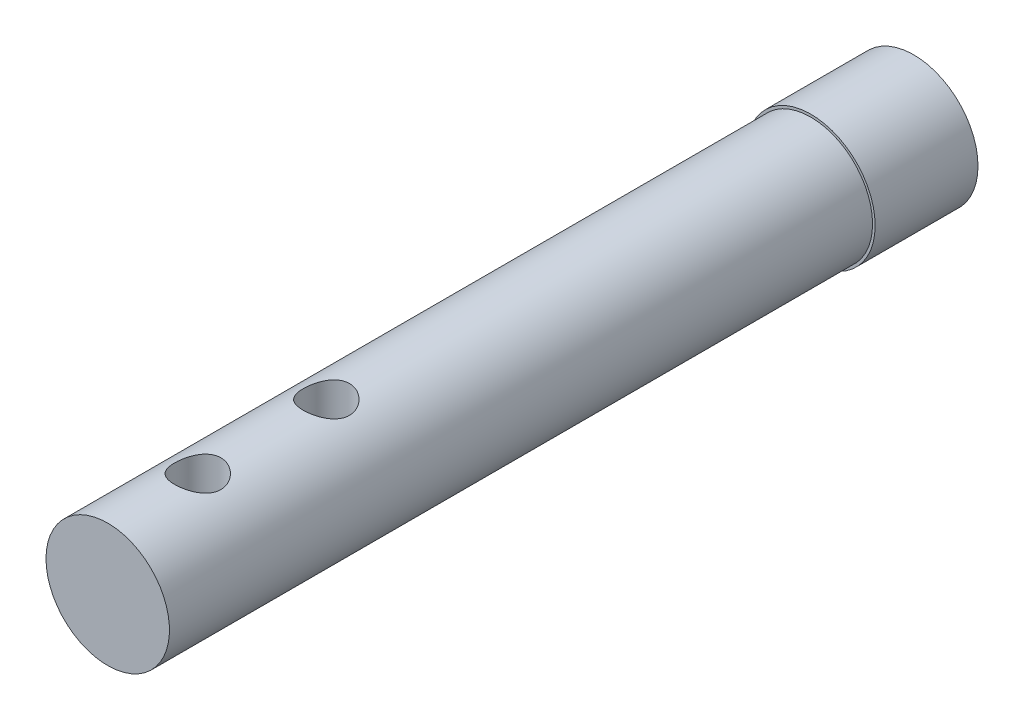
ISO-10303-21;
HEADER;
FILE_DESCRIPTION(('STEP AP214'),'2;1');
FILE_NAME('part.step','',(''),(''),'','','');
FILE_SCHEMA(('AUTOMOTIVE_DESIGN { 1 0 10303 214 1 1 1 1 }'));
ENDSEC;
DATA;
#1=APPLICATION_CONTEXT('core data for automotive mechanical design processes');
#2=APPLICATION_PROTOCOL_DEFINITION('international standard','automotive_design',2000,#1);
#3=PRODUCT_CONTEXT('',#1,'mechanical');
#4=PRODUCT('Part','Part','',(#3));
#5=PRODUCT_RELATED_PRODUCT_CATEGORY('part','',(#4));
#6=PRODUCT_DEFINITION_FORMATION('','',#4);
#7=PRODUCT_DEFINITION_CONTEXT('part definition',#1,'design');
#8=PRODUCT_DEFINITION('design','',#6,#7);
#9=PRODUCT_DEFINITION_SHAPE('','',#8);
#10=(LENGTH_UNIT() NAMED_UNIT(*) SI_UNIT(.MILLI.,.METRE.));
#11=(NAMED_UNIT(*) PLANE_ANGLE_UNIT() SI_UNIT($,.RADIAN.));
#12=(NAMED_UNIT(*) SI_UNIT($,.STERADIAN.) SOLID_ANGLE_UNIT());
#13=UNCERTAINTY_MEASURE_WITH_UNIT(LENGTH_MEASURE(1.E-05),#10,'distance_accuracy_value','');
#14=(GEOMETRIC_REPRESENTATION_CONTEXT(3) GLOBAL_UNCERTAINTY_ASSIGNED_CONTEXT((#13)) GLOBAL_UNIT_ASSIGNED_CONTEXT((#10,
#11,#12)) REPRESENTATION_CONTEXT('',''));
#15=CARTESIAN_POINT('',(0.,0.,0.));
#16=DIRECTION('',(0.,0.,1.));
#17=DIRECTION('',(1.,0.,0.));
#18=AXIS2_PLACEMENT_3D('',#15,#16,#17);
#19=CARTESIAN_POINT('',(0.,0.,35.));
#20=DIRECTION('',(0.,0.,-1.));
#21=DIRECTION('',(-1.,0.,0.));
#22=AXIS2_PLACEMENT_3D('',#19,#20,#21);
#23=CYLINDRICAL_SURFACE('',#22,12.5);
#24=CARTESIAN_POINT('',(0.,0.,35.));
#25=DIRECTION('',(0.,0.,1.));
#26=DIRECTION('',(1.,0.,0.));
#27=AXIS2_PLACEMENT_3D('',#24,#25,#26);
#28=CIRCLE('',#27,12.5);
#29=CARTESIAN_POINT('',(12.5,0.,35.));
#30=VERTEX_POINT('',#29);
#31=EDGE_CURVE('E37',#30,#30,#28,.T.);
#32=ORIENTED_EDGE('',*,*,#31,.F.);
#33=EDGE_LOOP('',(#32));
#34=FACE_BOUND('',#33,.T.);
#35=CARTESIAN_POINT('',(0.,0.,15.));
#36=DIRECTION('',(0.,0.,1.));
#37=DIRECTION('',(1.,0.,0.));
#38=AXIS2_PLACEMENT_3D('',#35,#36,#37);
#39=CIRCLE('',#38,12.5);
#40=CARTESIAN_POINT('',(12.5,0.,15.));
#41=VERTEX_POINT('',#40);
#42=EDGE_CURVE('E42',#41,#41,#39,.T.);
#43=ORIENTED_EDGE('',*,*,#42,.T.);
#44=EDGE_LOOP('',(#43));
#45=FACE_BOUND('',#44,.T.);
#46=ADVANCED_FACE('F30',(#34,#45),#23,.T.);
#47=CARTESIAN_POINT('',(0.,0.,35.));
#48=DIRECTION('',(0.,0.,1.));
#49=DIRECTION('',(1.,0.,0.));
#50=AXIS2_PLACEMENT_3D('',#47,#48,#49);
#51=PLANE('',#50);
#52=CARTESIAN_POINT('',(0.,0.,35.));
#53=DIRECTION('',(0.,0.,1.));
#54=DIRECTION('',(1.,0.,0.));
#55=AXIS2_PLACEMENT_3D('',#52,#53,#54);
#56=CIRCLE('',#55,12.);
#57=CARTESIAN_POINT('',(12.,0.,35.));
#58=VERTEX_POINT('',#57);
#59=EDGE_CURVE('E10',#58,#58,#56,.T.);
#60=ORIENTED_EDGE('',*,*,#59,.F.);
#61=EDGE_LOOP('',(#60));
#62=FACE_BOUND('',#61,.T.);
#63=ORIENTED_EDGE('',*,*,#31,.T.);
#64=EDGE_LOOP('',(#63));
#65=FACE_BOUND('',#64,.T.);
#66=ADVANCED_FACE('F98',(#62,#65),#51,.T.);
#67=CARTESIAN_POINT('',(0.,0.,15.));
#68=DIRECTION('',(0.,0.,1.));
#69=DIRECTION('',(1.,0.,0.));
#70=AXIS2_PLACEMENT_3D('',#67,#68,#69);
#71=PLANE('',#70);
#72=ORIENTED_EDGE('',*,*,#42,.F.);
#73=EDGE_LOOP('',(#72));
#74=FACE_BOUND('',#73,.T.);
#75=ADVANCED_FACE('F103',(#74),#71,.F.);
#76=CARTESIAN_POINT('',(0.,0.,174.2));
#77=DIRECTION('',(0.,0.,-1.));
#78=DIRECTION('',(-1.,0.,0.));
#79=AXIS2_PLACEMENT_3D('',#76,#77,#78);
#80=CYLINDRICAL_SURFACE('',#79,12.);
#81=CARTESIAN_POINT('',(0.,0.,171.7));
#82=DIRECTION('',(0.,0.,-1.));
#83=DIRECTION('',(-1.,0.,0.));
#84=AXIS2_PLACEMENT_3D('',#81,#82,#83);
#85=CIRCLE('',#84,12.);
#86=CARTESIAN_POINT('',(-12.,0.,171.7));
#87=VERTEX_POINT('',#86);
#88=EDGE_CURVE('E33',#87,#87,#85,.T.);
#89=ORIENTED_EDGE('',*,*,#88,.T.);
#90=EDGE_LOOP('',(#89));
#91=FACE_BOUND('',#90,.T.);
#92=CARTESIAN_POINT('',(0.,-12.,133.7));
#93=CARTESIAN_POINT('',(0.121821920216141,-12.0000004149463,133.700000562589));
#94=CARTESIAN_POINT('',(0.243636002691335,-11.9981409348073,133.695049364538));
#95=CARTESIAN_POINT('',(0.486392423781216,-11.9907535477711,133.675293911887));
#96=CARTESIAN_POINT('',(0.607334471202253,-11.9852244680872,133.660486507286));
#97=CARTESIAN_POINT('',(0.847347381687188,-11.970649565472,133.621174413436));
#98=CARTESIAN_POINT('',(0.966419205128135,-11.9616056132673,133.596674882519));
#99=CARTESIAN_POINT('',(1.2019581040135,-11.9402382455256,133.53820576059));
#100=CARTESIAN_POINT('',(1.31842414848255,-11.9279135559973,133.504232490447));
#101=CARTESIAN_POINT('',(1.54765442429004,-11.9003384511568,133.427214849951));
#102=CARTESIAN_POINT('',(1.66042673449101,-11.8850950009216,133.384192050998));
#103=CARTESIAN_POINT('',(1.88185705605879,-11.8520536393113,133.289393964956));
#104=CARTESIAN_POINT('',(1.99051352350809,-11.8342547811235,133.237615432482));
#105=CARTESIAN_POINT('',(2.30927279411985,-11.7776768093622,133.069731594457));
#106=CARTESIAN_POINT('',(2.51234231941558,-11.7356939966761,132.941018203868));
#107=CARTESIAN_POINT('',(2.90206977477989,-11.6455850212357,132.648156633399));
#108=CARTESIAN_POINT('',(3.08780172063125,-11.5972851945296,132.482840477992));
#109=CARTESIAN_POINT('',(3.42974311725175,-11.500801507554,132.123737421702));
#110=CARTESIAN_POINT('',(3.58594353155377,-11.4526176872201,131.929941838426));
#111=CARTESIAN_POINT('',(3.79764477617944,-11.3834841407686,131.617559070828));
#112=CARTESIAN_POINT('',(3.86547493196535,-11.3605705131175,131.507562616254));
#113=CARTESIAN_POINT('',(3.99157408188856,-11.3168804194774,131.281831512047));
#114=CARTESIAN_POINT('',(4.04984690983616,-11.2961030977882,131.166099187672));
#115=CARTESIAN_POINT('',(4.15634309619244,-11.257354412399,130.929634242611));
#116=CARTESIAN_POINT('',(4.20456527896397,-11.2393833770156,130.808901038945));
#117=CARTESIAN_POINT('',(4.29047551547084,-11.2068698048304,130.563350953977));
#118=CARTESIAN_POINT('',(4.32816865016454,-11.1923256148824,130.438536074949));
#119=CARTESIAN_POINT('',(4.3913383306389,-11.167687799886,130.190864282486));
#120=CARTESIAN_POINT('',(4.41724869222401,-11.1574374723367,130.068133574559));
#121=CARTESIAN_POINT('',(4.45874705417236,-11.1409189584307,129.820724885637));
#122=CARTESIAN_POINT('',(4.47433956871922,-11.1346490306496,129.696047780687));
#123=CARTESIAN_POINT('',(4.49504192825722,-11.1263077224061,129.445703904304));
#124=CARTESIAN_POINT('',(4.50015334189904,-11.124235713664,129.320037283793));
#125=CARTESIAN_POINT('',(4.4998396408155,-11.124362586323,129.068723898627));
#126=CARTESIAN_POINT('',(4.49441493477359,-11.1265613020677,128.94307713339));
#127=CARTESIAN_POINT('',(4.47373138181252,-11.1348931002806,128.700345583509));
#128=CARTESIAN_POINT('',(4.45908334347361,-11.1407817124043,128.583200175152));
#129=CARTESIAN_POINT('',(4.42068867776497,-11.1560711786316,128.350631735769));
#130=CARTESIAN_POINT('',(4.39693902815624,-11.1654731993557,128.235209290103));
#131=CARTESIAN_POINT('',(4.31234407385654,-11.1985472030748,127.892770983112));
#132=CARTESIAN_POINT('',(4.23813423625877,-11.2270952052095,127.669371280221));
#133=CARTESIAN_POINT('',(4.05490721343478,-11.294571324263,127.234132319446));
#134=CARTESIAN_POINT('',(3.94525805379047,-11.3336856090865,127.02259174478));
#135=CARTESIAN_POINT('',(3.69468362169031,-11.417826234714,126.620172587469));
#136=CARTESIAN_POINT('',(3.55374755073013,-11.4628546145386,126.429301172593));
#137=CARTESIAN_POINT('',(3.23345300799872,-11.5574411862383,126.060186122089));
#138=CARTESIAN_POINT('',(3.05214885027355,-11.607100429164,125.88365330368));
#139=CARTESIAN_POINT('',(2.66193788370924,-11.7027518394278,125.562986875577));
#140=CARTESIAN_POINT('',(2.45302684040981,-11.7487434424691,125.418858245353));
#141=CARTESIAN_POINT('',(2.00917028059687,-11.8327918458053,125.165208596408));
#142=CARTESIAN_POINT('',(1.77387213379261,-11.8707149483013,125.056257198474));
#143=CARTESIAN_POINT('',(1.28651055931184,-11.9333615492963,124.880052245027));
#144=CARTESIAN_POINT('',(1.03445463312944,-11.9580909097264,124.8127801694));
#145=CARTESIAN_POINT('',(0.535125728885334,-11.9905332973328,124.725131619306));
#146=CARTESIAN_POINT('',(0.288310863440804,-11.9990810722223,124.702452162351));
#147=CARTESIAN_POINT('',(-0.205717430518202,-12.0007768095524,124.697926826798));
#148=CARTESIAN_POINT('',(-0.452930758520925,-11.9939281862917,124.716071894972));
#149=CARTESIAN_POINT('',(-0.930786126866781,-11.9661512982893,124.790930073153));
#150=CARTESIAN_POINT('',(-1.16169991458787,-11.9457741475744,124.846134437354));
#151=CARTESIAN_POINT('',(-1.61082533431484,-11.8935442940439,124.991558411525));
#152=CARTESIAN_POINT('',(-1.82903531000968,-11.8616900987367,125.081782575637));
#153=CARTESIAN_POINT('',(-2.25374302875422,-11.7884888040033,125.297558494317));
#154=CARTESIAN_POINT('',(-2.45970824228689,-11.7468902777666,125.424070377444));
#155=CARTESIAN_POINT('',(-2.8481791439392,-11.6587998753534,125.70775712078));
#156=CARTESIAN_POINT('',(-3.03067612982123,-11.6123061955645,125.864943301224));
#157=CARTESIAN_POINT('',(-3.37808840855275,-11.516200958323,126.216201253386));
#158=CARTESIAN_POINT('',(-3.54136933947529,-11.4665650100461,126.411883953797));
#159=CARTESIAN_POINT('',(-3.8331467865608,-11.372360357102,126.828996752467));
#160=CARTESIAN_POINT('',(-3.96164017919756,-11.3277921076647,127.050429160208));
#161=CARTESIAN_POINT('',(-4.12541953452076,-11.2687303690453,127.397922796397));
#162=CARTESIAN_POINT('',(-4.17527938653559,-11.2503030894951,127.516647329586));
#163=CARTESIAN_POINT('',(-4.26475585416723,-11.2166905930926,127.758323845116));
#164=CARTESIAN_POINT('',(-4.30437682733462,-11.2015039975232,127.881274003754));
#165=CARTESIAN_POINT('',(-4.37296242168506,-11.1749073223601,128.130466472104));
#166=CARTESIAN_POINT('',(-4.40193024471254,-11.163496108165,128.256707780413));
#167=CARTESIAN_POINT('',(-4.44890662829911,-11.1448585297206,128.51151813959));
#168=CARTESIAN_POINT('',(-4.46691595320739,-11.1376318736025,128.640087027466));
#169=CARTESIAN_POINT('',(-4.4909611175474,-11.1279568107625,128.890138338187));
#170=CARTESIAN_POINT('',(-4.4976937576826,-11.1252304971503,129.011543515748));
#171=CARTESIAN_POINT('',(-4.50131029580419,-11.1237678185175,129.254568299403));
#172=CARTESIAN_POINT('',(-4.49819087218451,-11.1250327991546,129.376187963996));
#173=CARTESIAN_POINT('',(-4.48213280066959,-11.131512007523,129.618611778483));
#174=CARTESIAN_POINT('',(-4.46919877710471,-11.1367243753675,129.739416285416));
#175=CARTESIAN_POINT('',(-4.4336489114592,-11.150924738849,129.979410101132));
#176=CARTESIAN_POINT('',(-4.41102942370239,-11.1599141561698,130.098598784262));
#177=CARTESIAN_POINT('',(-4.35718066722756,-11.1810458214159,130.330811506595));
#178=CARTESIAN_POINT('',(-4.32623979458421,-11.1930817833517,130.443912139277));
#179=CARTESIAN_POINT('',(-4.25575591081443,-11.220069483486,130.667056271898));
#180=CARTESIAN_POINT('',(-4.216209885475,-11.23502224319,130.777098685333));
#181=CARTESIAN_POINT('',(-4.08512625929659,-11.2836374066331,131.101595505612));
#182=CARTESIAN_POINT('',(-3.98110253179988,-11.3210734609741,131.310592817196));
#183=CARTESIAN_POINT('',(-3.73655960136618,-11.4041928736043,131.719509886323));
#184=CARTESIAN_POINT('',(-3.59441315608531,-11.4502056852775,131.918379513829));
#185=CARTESIAN_POINT('',(-3.28000639093494,-11.5441926723435,132.290437563583));
#186=CARTESIAN_POINT('',(-3.10773650011229,-11.5921674673836,132.463617791262));
#187=CARTESIAN_POINT('',(-2.82485495768736,-11.6632064644304,132.705245875948));
#188=CARTESIAN_POINT('',(-2.72355677041139,-11.6873329442322,132.784523984934));
#189=CARTESIAN_POINT('',(-2.5143325103599,-11.7341212355869,132.934254321495));
#190=CARTESIAN_POINT('',(-2.40640888366377,-11.7567835814237,133.004709777492));
#191=CARTESIAN_POINT('',(-2.18454509687348,-11.8000231112314,133.136294134108));
#192=CARTESIAN_POINT('',(-2.07060177268691,-11.8205991816831,133.197418062869));
#193=CARTESIAN_POINT('',(-1.83755175113718,-11.8590616275344,133.309759993606));
#194=CARTESIAN_POINT('',(-1.71844727331547,-11.8769491446375,133.36098220304));
#195=CARTESIAN_POINT('',(-1.47053797162902,-11.9102407175975,133.455097964792));
#196=CARTESIAN_POINT('',(-1.34153686175291,-11.9255011706843,133.497526838323));
#197=CARTESIAN_POINT('',(-1.07989915577463,-11.9520331999052,133.570612963128));
#198=CARTESIAN_POINT('',(-0.947264179674953,-11.9633065233273,133.601275371348));
#199=CARTESIAN_POINT('',(-0.679492491904581,-11.9814979813589,133.650485060083));
#200=CARTESIAN_POINT('',(-0.544356226207072,-11.9884168847946,133.669034479318));
#201=CARTESIAN_POINT('',(-0.272809934790551,-11.9976674031164,133.693790938277));
#202=CARTESIAN_POINT('',(-0.136400054481801,-11.9999995353981,133.699999370088));
#203=CARTESIAN_POINT('',(0.,-12.,133.7));
#204=B_SPLINE_CURVE_WITH_KNOTS('',3,(#92,#93,#94,#95,#96,#97,#98,#99,#100,#101,#102,#103,#104,
#105,#106,#107,#108,#109,#110,#111,#112,#113,#114,#115,#116,#117,#118,#119,#120,#121,#122,#123,
#124,#125,#126,#127,#128,#129,#130,#131,#132,#133,#134,#135,#136,#137,#138,#139,#140,#141,#142,
#143,#144,#145,#146,#147,#148,#149,#150,#151,#152,#153,#154,#155,#156,#157,#158,#159,#160,#161,
#162,#163,#164,#165,#166,#167,#168,#169,#170,#171,#172,#173,#174,#175,#176,#177,#178,#179,#180,
#181,#182,#183,#184,#185,#186,#187,#188,#189,#190,#191,#192,#193,#194,#195,#196,#197,#198,#199,
#200,#201,#202,#203),.UNSPECIFIED.,.T.,.F.,(4,2,2,2,2,2,2,2,2,2,2,2,2,2,2,2,2,2,2,2,2,2,2,2,2,2,
2,2,2,2,2,2,2,2,2,2,2,2,2,2,2,2,2,2,2,2,2,2,2,2,2,2,2,2,2,4),(0.,0.365338024506953,
0.730792865566528,1.09605346575198,1.46145611308566,1.82599742407275,2.19067415273864,
2.91947018392637,3.67616860257937,4.43309819286657,4.82642681378567,5.21959726757261,
5.6128136852447,6.00584002102328,6.38291145568139,6.75981780772976,7.13666774608809,
7.5135030671805,7.86768402280124,8.22198268815958,8.92994647641832,9.65130458621122,
10.3729120569284,11.143016934675,11.9132400717527,12.6953735931829,13.477159325566,
14.2173829236784,14.9574423863163,15.6690654723159,16.3807811322343,17.1134089903886,
17.8463077351967,18.6217279182704,19.3972177022049,19.7870381951626,20.1766925107005,
20.5662296182681,20.9557395527225,21.3201489316714,21.6846811837187,22.0490417862153,
22.4135396573091,22.7667469946614,23.1200782532196,23.8262105801188,24.5693581369517,
25.3127422403355,25.7049754844993,26.0970647789657,26.4893622558027,26.8814926686161,
27.2908478409866,27.7000233978563,28.1091266894863,28.5181838309154),.UNSPECIFIED.);
#205=CARTESIAN_POINT('',(0.,-12.,133.7));
#206=VERTEX_POINT('',#205);
#207=EDGE_CURVE('E56',#206,#206,#204,.T.);
#208=ORIENTED_EDGE('',*,*,#207,.T.);
#209=EDGE_LOOP('',(#208));
#210=FACE_BOUND('',#209,.T.);
#211=CARTESIAN_POINT('',(0.,12.,133.7));
#212=CARTESIAN_POINT('',(-0.121821920216148,12.0000004149463,133.700000562589));
#213=CARTESIAN_POINT('',(-0.243636002691342,11.9981409348073,133.695049364538));
#214=CARTESIAN_POINT('',(-0.486392423781223,11.9907535477711,133.675293911887));
#215=CARTESIAN_POINT('',(-0.60733447120226,11.9852244680872,133.660486507286));
#216=CARTESIAN_POINT('',(-0.847347381687196,11.970649565472,133.621174413436));
#217=CARTESIAN_POINT('',(-0.966419205128143,11.9616056132673,133.596674882519));
#218=CARTESIAN_POINT('',(-1.20195810401351,11.9402382455256,133.53820576059));
#219=CARTESIAN_POINT('',(-1.31842414848256,11.9279135559973,133.504232490447));
#220=CARTESIAN_POINT('',(-1.54765442429005,11.9003384511568,133.427214849951));
#221=CARTESIAN_POINT('',(-1.66042673449102,11.8850950009216,133.384192050998));
#222=CARTESIAN_POINT('',(-1.88185705605881,11.8520536393113,133.289393964956));
#223=CARTESIAN_POINT('',(-1.9905135235081,11.8342547811235,133.237615432482));
#224=CARTESIAN_POINT('',(-2.30927279411986,11.7776768093622,133.069731594457));
#225=CARTESIAN_POINT('',(-2.51234231941559,11.7356939966761,132.941018203868));
#226=CARTESIAN_POINT('',(-2.9020697747799,11.6455850212357,132.648156633399));
#227=CARTESIAN_POINT('',(-3.08780172063126,11.5972851945296,132.482840477992));
#228=CARTESIAN_POINT('',(-3.42974311725176,11.500801507554,132.123737421702));
#229=CARTESIAN_POINT('',(-3.58594353155377,11.4526176872201,131.929941838426));
#230=CARTESIAN_POINT('',(-3.79764477617945,11.3834841407686,131.617559070828));
#231=CARTESIAN_POINT('',(-3.86547493196536,11.3605705131175,131.507562616254));
#232=CARTESIAN_POINT('',(-3.99157408188856,11.3168804194774,131.281831512047));
#233=CARTESIAN_POINT('',(-4.04984690983617,11.2961030977882,131.166099187672));
#234=CARTESIAN_POINT('',(-4.15634309619245,11.257354412399,130.929634242611));
#235=CARTESIAN_POINT('',(-4.20456527896398,11.2393833770156,130.808901038945));
#236=CARTESIAN_POINT('',(-4.29047551547085,11.2068698048304,130.563350953977));
#237=CARTESIAN_POINT('',(-4.32816865016455,11.1923256148824,130.438536074949));
#238=CARTESIAN_POINT('',(-4.3913383306389,11.167687799886,130.190864282486));
#239=CARTESIAN_POINT('',(-4.41724869222402,11.1574374723367,130.068133574559));
#240=CARTESIAN_POINT('',(-4.45874705417237,11.1409189584307,129.820724885637));
#241=CARTESIAN_POINT('',(-4.47433956871923,11.1346490306496,129.696047780687));
#242=CARTESIAN_POINT('',(-4.49504192825722,11.1263077224061,129.445703904304));
#243=CARTESIAN_POINT('',(-4.50015334189905,11.124235713664,129.320037283793));
#244=CARTESIAN_POINT('',(-4.49983964081551,11.124362586323,129.068723898627));
#245=CARTESIAN_POINT('',(-4.4944149347736,11.1265613020677,128.94307713339));
#246=CARTESIAN_POINT('',(-4.47373138181252,11.1348931002806,128.700345583509));
#247=CARTESIAN_POINT('',(-4.45908334347362,11.1407817124043,128.583200175152));
#248=CARTESIAN_POINT('',(-4.42068867776498,11.1560711786316,128.350631735769));
#249=CARTESIAN_POINT('',(-4.39693902815624,11.1654731993557,128.235209290103));
#250=CARTESIAN_POINT('',(-4.31234407385655,11.1985472030748,127.892770983112));
#251=CARTESIAN_POINT('',(-4.23813423625877,11.2270952052095,127.669371280221));
#252=CARTESIAN_POINT('',(-4.05490721343479,11.294571324263,127.234132319446));
#253=CARTESIAN_POINT('',(-3.94525805379048,11.3336856090865,127.02259174478));
#254=CARTESIAN_POINT('',(-3.69468362169032,11.417826234714,126.620172587469));
#255=CARTESIAN_POINT('',(-3.55374755073014,11.4628546145386,126.429301172593));
#256=CARTESIAN_POINT('',(-3.23345300799872,11.5574411862383,126.060186122089));
#257=CARTESIAN_POINT('',(-3.05214885027355,11.607100429164,125.88365330368));
#258=CARTESIAN_POINT('',(-2.66193788370925,11.7027518394278,125.562986875577));
#259=CARTESIAN_POINT('',(-2.45302684040981,11.7487434424691,125.418858245353));
#260=CARTESIAN_POINT('',(-2.00917028059688,11.8327918458053,125.165208596408));
#261=CARTESIAN_POINT('',(-1.77387213379261,11.8707149483013,125.056257198474));
#262=CARTESIAN_POINT('',(-1.28651055931184,11.9333615492963,124.880052245027));
#263=CARTESIAN_POINT('',(-1.03445463312944,11.9580909097264,124.8127801694));
#264=CARTESIAN_POINT('',(-0.535125728885343,11.9905332973328,124.725131619306));
#265=CARTESIAN_POINT('',(-0.288310863440812,11.9990810722223,124.702452162351));
#266=CARTESIAN_POINT('',(0.205717430518194,12.0007768095524,124.697926826798));
#267=CARTESIAN_POINT('',(0.452930758520917,11.9939281862917,124.716071894972));
#268=CARTESIAN_POINT('',(0.930786126866772,11.9661512982893,124.790930073153));
#269=CARTESIAN_POINT('',(1.16169991458786,11.9457741475744,124.846134437354));
#270=CARTESIAN_POINT('',(1.61082533431484,11.8935442940439,124.991558411525));
#271=CARTESIAN_POINT('',(1.82903531000967,11.8616900987367,125.081782575637));
#272=CARTESIAN_POINT('',(2.25374302875422,11.7884888040033,125.297558494317));
#273=CARTESIAN_POINT('',(2.45970824228691,11.7468902777666,125.424070377444));
#274=CARTESIAN_POINT('',(2.84817914393921,11.6587998753534,125.70775712078));
#275=CARTESIAN_POINT('',(3.03067612982124,11.6123061955645,125.864943301224));
#276=CARTESIAN_POINT('',(3.37808840855274,11.516200958323,126.216201253386));
#277=CARTESIAN_POINT('',(3.54136933947528,11.4665650100462,126.411883953797));
#278=CARTESIAN_POINT('',(3.8331467865608,11.372360357102,126.828996752467));
#279=CARTESIAN_POINT('',(3.96164017919755,11.3277921076647,127.050429160208));
#280=CARTESIAN_POINT('',(4.12541953452075,11.2687303690453,127.397922796397));
#281=CARTESIAN_POINT('',(4.17527938653558,11.2503030894951,127.516647329586));
#282=CARTESIAN_POINT('',(4.26475585416722,11.2166905930926,127.758323845116));
#283=CARTESIAN_POINT('',(4.30437682733461,11.2015039975232,127.881274003754));
#284=CARTESIAN_POINT('',(4.37296242168505,11.1749073223601,128.130466472104));
#285=CARTESIAN_POINT('',(4.40193024471254,11.163496108165,128.256707780413));
#286=CARTESIAN_POINT('',(4.44890662829911,11.1448585297206,128.51151813959));
#287=CARTESIAN_POINT('',(4.46691595320738,11.1376318736025,128.640087027466));
#288=CARTESIAN_POINT('',(4.49096111754739,11.1279568107625,128.890138338187));
#289=CARTESIAN_POINT('',(4.49769375768259,11.1252304971503,129.011543515748));
#290=CARTESIAN_POINT('',(4.50131029580418,11.1237678185175,129.254568299403));
#291=CARTESIAN_POINT('',(4.4981908721845,11.1250327991546,129.376187963996));
#292=CARTESIAN_POINT('',(4.48213280066958,11.131512007523,129.618611778483));
#293=CARTESIAN_POINT('',(4.46919877710471,11.1367243753675,129.739416285416));
#294=CARTESIAN_POINT('',(4.4336489114592,11.150924738849,129.979410101132));
#295=CARTESIAN_POINT('',(4.41102942370238,11.1599141561698,130.098598784262));
#296=CARTESIAN_POINT('',(4.35718066722755,11.1810458214159,130.330811506595));
#297=CARTESIAN_POINT('',(4.3262397945842,11.1930817833517,130.443912139277));
#298=CARTESIAN_POINT('',(4.25575591081443,11.220069483486,130.667056271898));
#299=CARTESIAN_POINT('',(4.21620988547499,11.23502224319,130.777098685333));
#300=CARTESIAN_POINT('',(4.08512625929658,11.2836374066331,131.101595505612));
#301=CARTESIAN_POINT('',(3.98110253179987,11.3210734609741,131.310592817196));
#302=CARTESIAN_POINT('',(3.73655960136618,11.4041928736043,131.719509886323));
#303=CARTESIAN_POINT('',(3.5944131560853,11.4502056852775,131.918379513829));
#304=CARTESIAN_POINT('',(3.28000639093493,11.5441926723435,132.290437563583));
#305=CARTESIAN_POINT('',(3.10773650011228,11.5921674673836,132.463617791262));
#306=CARTESIAN_POINT('',(2.82485495768736,11.6632064644304,132.705245875948));
#307=CARTESIAN_POINT('',(2.72355677041138,11.6873329442322,132.784523984934));
#308=CARTESIAN_POINT('',(2.51433251035989,11.7341212355869,132.934254321495));
#309=CARTESIAN_POINT('',(2.40640888366376,11.7567835814237,133.004709777492));
#310=CARTESIAN_POINT('',(2.18454509687347,11.8000231112314,133.136294134108));
#311=CARTESIAN_POINT('',(2.0706017726869,11.8205991816831,133.197418062869));
#312=CARTESIAN_POINT('',(1.83755175113717,11.8590616275344,133.309759993606));
#313=CARTESIAN_POINT('',(1.71844727331546,11.8769491446375,133.36098220304));
#314=CARTESIAN_POINT('',(1.47053797162901,11.9102407175975,133.455097964792));
#315=CARTESIAN_POINT('',(1.3415368617529,11.9255011706843,133.497526838323));
#316=CARTESIAN_POINT('',(1.07989915577463,11.9520331999052,133.570612963128));
#317=CARTESIAN_POINT('',(0.947264179674952,11.9633065233273,133.601275371348));
#318=CARTESIAN_POINT('',(0.67949249190458,11.9814979813589,133.650485060083));
#319=CARTESIAN_POINT('',(0.54435622620707,11.9884168847946,133.669034479318));
#320=CARTESIAN_POINT('',(0.272809934790547,11.9976674031164,133.693790938277));
#321=CARTESIAN_POINT('',(0.136400054481796,11.9999995353981,133.699999370088));
#322=CARTESIAN_POINT('',(0.,12.,133.7));
#323=B_SPLINE_CURVE_WITH_KNOTS('',3,(#211,#212,#213,#214,#215,#216,#217,#218,#219,#220,#221,
#222,#223,#224,#225,#226,#227,#228,#229,#230,#231,#232,#233,#234,#235,#236,#237,#238,#239,#240,
#241,#242,#243,#244,#245,#246,#247,#248,#249,#250,#251,#252,#253,#254,#255,#256,#257,#258,#259,
#260,#261,#262,#263,#264,#265,#266,#267,#268,#269,#270,#271,#272,#273,#274,#275,#276,#277,#278,
#279,#280,#281,#282,#283,#284,#285,#286,#287,#288,#289,#290,#291,#292,#293,#294,#295,#296,#297,
#298,#299,#300,#301,#302,#303,#304,#305,#306,#307,#308,#309,#310,#311,#312,#313,#314,#315,#316,
#317,#318,#319,#320,#321,#322),.UNSPECIFIED.,.T.,.F.,(4,2,2,2,2,2,2,2,2,2,2,2,2,2,2,2,2,2,2,2,2,
2,2,2,2,2,2,2,2,2,2,2,2,2,2,2,2,2,2,2,2,2,2,2,2,2,2,2,2,2,2,2,2,2,2,4),(0.,0.365338024506953,
0.730792865566528,1.09605346575198,1.46145611308566,1.82599742407276,2.19067415273864,
2.91947018392637,3.67616860257937,4.43309819286657,4.82642681378567,5.21959726757261,
5.6128136852447,6.00584002102328,6.38291145568139,6.75981780772976,7.13666774608809,
7.5135030671805,7.86768402280124,8.22198268815958,8.92994647641832,9.65130458621122,
10.3729120569284,11.1430169346751,11.9132400717527,12.6953735931829,13.477159325566,
14.2173829236784,14.9574423863163,15.6690654723159,16.3807811322343,17.1134089903887,
17.8463077351967,18.6217279182704,19.3972177022049,19.7870381951626,20.1766925107005,
20.5662296182681,20.9557395527225,21.3201489316714,21.6846811837187,22.0490417862153,
22.4135396573091,22.7667469946614,23.1200782532196,23.8262105801188,24.5693581369517,
25.3127422403355,25.7049754844993,26.0970647789657,26.4893622558027,26.8814926686161,
27.2908478409866,27.7000233978563,28.1091266894863,28.5181838309154),.UNSPECIFIED.);
#324=CARTESIAN_POINT('',(0.,12.,133.7));
#325=VERTEX_POINT('',#324);
#326=EDGE_CURVE('E77',#325,#325,#323,.T.);
#327=ORIENTED_EDGE('',*,*,#326,.T.);
#328=EDGE_LOOP('',(#327));
#329=FACE_BOUND('',#328,.T.);
#330=CARTESIAN_POINT('',(0.,-12.,158.7));
#331=CARTESIAN_POINT('',(0.121821920216141,-12.0000004149463,158.700000562589));
#332=CARTESIAN_POINT('',(0.243636002691335,-11.9981409348073,158.695049364538));
#333=CARTESIAN_POINT('',(0.486392423781216,-11.9907535477711,158.675293911887));
#334=CARTESIAN_POINT('',(0.607334471202253,-11.9852244680872,158.660486507286));
#335=CARTESIAN_POINT('',(0.84734738168719,-11.970649565472,158.621174413436));
#336=CARTESIAN_POINT('',(0.966419205128139,-11.9616056132673,158.596674882519));
#337=CARTESIAN_POINT('',(1.20195810401351,-11.9402382455256,158.53820576059));
#338=CARTESIAN_POINT('',(1.31842414848256,-11.9279135559973,158.504232490447));
#339=CARTESIAN_POINT('',(1.54765442429003,-11.9003384511568,158.427214849951));
#340=CARTESIAN_POINT('',(1.660426734491,-11.8850950009216,158.384192050998));
#341=CARTESIAN_POINT('',(1.88185705605878,-11.8520536393113,158.289393964957));
#342=CARTESIAN_POINT('',(1.99051352350808,-11.8342547811235,158.237615432482));
#343=CARTESIAN_POINT('',(2.30927279411985,-11.7776768093622,158.069731594457));
#344=CARTESIAN_POINT('',(2.51234231941558,-11.7356939966761,157.941018203868));
#345=CARTESIAN_POINT('',(2.90206977477989,-11.6455850212357,157.648156633399));
#346=CARTESIAN_POINT('',(3.08780172063126,-11.5972851945296,157.482840477992));
#347=CARTESIAN_POINT('',(3.42974311725176,-11.500801507554,157.123737421702));
#348=CARTESIAN_POINT('',(3.58594353155377,-11.4526176872201,156.929941838426));
#349=CARTESIAN_POINT('',(3.79764477617944,-11.3834841407686,156.617559070828));
#350=CARTESIAN_POINT('',(3.86547493196534,-11.3605705131175,156.507562616254));
#351=CARTESIAN_POINT('',(3.99157408188855,-11.3168804194774,156.281831512047));
#352=CARTESIAN_POINT('',(4.04984690983615,-11.2961030977882,156.166099187672));
#353=CARTESIAN_POINT('',(4.15634309619243,-11.2573544123991,155.929634242611));
#354=CARTESIAN_POINT('',(4.20456527896396,-11.2393833770156,155.808901038945));
#355=CARTESIAN_POINT('',(4.29047551547084,-11.2068698048304,155.563350953977));
#356=CARTESIAN_POINT('',(4.32816865016454,-11.1923256148824,155.438536074949));
#357=CARTESIAN_POINT('',(4.39133833063889,-11.167687799886,155.190864282486));
#358=CARTESIAN_POINT('',(4.41724869222401,-11.1574374723367,155.068133574559));
#359=CARTESIAN_POINT('',(4.45874705417236,-11.1409189584307,154.820724885637));
#360=CARTESIAN_POINT('',(4.47433956871922,-11.1346490306496,154.696047780687));
#361=CARTESIAN_POINT('',(4.49504192825721,-11.1263077224061,154.445703904304));
#362=CARTESIAN_POINT('',(4.50015334189904,-11.124235713664,154.320037283793));
#363=CARTESIAN_POINT('',(4.4998396408155,-11.124362586323,154.068723898627));
#364=CARTESIAN_POINT('',(4.49441493477359,-11.1265613020677,153.94307713339));
#365=CARTESIAN_POINT('',(4.47373138181252,-11.1348931002806,153.700345583509));
#366=CARTESIAN_POINT('',(4.45908334347361,-11.1407817124043,153.583200175152));
#367=CARTESIAN_POINT('',(4.42068867776497,-11.1560711786316,153.350631735769));
#368=CARTESIAN_POINT('',(4.39693902815624,-11.1654731993557,153.235209290103));
#369=CARTESIAN_POINT('',(4.31234407385654,-11.1985472030748,152.892770983111));
#370=CARTESIAN_POINT('',(4.23813423625877,-11.2270952052095,152.669371280221));
#371=CARTESIAN_POINT('',(4.05490721343479,-11.294571324263,152.234132319446));
#372=CARTESIAN_POINT('',(3.94525805379047,-11.3336856090865,152.02259174478));
#373=CARTESIAN_POINT('',(3.69468362169031,-11.417826234714,151.620172587469));
#374=CARTESIAN_POINT('',(3.55374755073013,-11.4628546145386,151.429301172593));
#375=CARTESIAN_POINT('',(3.23345300799872,-11.5574411862383,151.060186122089));
#376=CARTESIAN_POINT('',(3.05214885027355,-11.607100429164,150.88365330368));
#377=CARTESIAN_POINT('',(2.66193788370924,-11.7027518394278,150.562986875577));
#378=CARTESIAN_POINT('',(2.45302684040981,-11.7487434424691,150.418858245353));
#379=CARTESIAN_POINT('',(2.00917028059687,-11.8327918458053,150.165208596408));
#380=CARTESIAN_POINT('',(1.77387213379261,-11.8707149483013,150.056257198474));
#381=CARTESIAN_POINT('',(1.28651055931183,-11.9333615492963,149.880052245027));
#382=CARTESIAN_POINT('',(1.03445463312943,-11.9580909097264,149.8127801694));
#383=CARTESIAN_POINT('',(0.535125728885332,-11.9905332973328,149.725131619306));
#384=CARTESIAN_POINT('',(0.288310863440802,-11.9990810722223,149.702452162351));
#385=CARTESIAN_POINT('',(-0.205717430518205,-12.0007768095524,149.697926826798));
#386=CARTESIAN_POINT('',(-0.452930758520928,-11.9939281862917,149.716071894972));
#387=CARTESIAN_POINT('',(-0.930786126866782,-11.9661512982893,149.790930073153));
#388=CARTESIAN_POINT('',(-1.16169991458787,-11.9457741475744,149.846134437354));
#389=CARTESIAN_POINT('',(-1.61082533431484,-11.8935442940439,149.991558411524));
#390=CARTESIAN_POINT('',(-1.82903531000967,-11.8616900987367,150.081782575637));
#391=CARTESIAN_POINT('',(-2.25374302875423,-11.7884888040033,150.297558494317));
#392=CARTESIAN_POINT('',(-2.4597082422869,-11.7468902777666,150.424070377444));
#393=CARTESIAN_POINT('',(-2.84817914393921,-11.6587998753534,150.70775712078));
#394=CARTESIAN_POINT('',(-3.03067612982124,-11.6123061955645,150.864943301224));
#395=CARTESIAN_POINT('',(-3.37808840855274,-11.516200958323,151.216201253386));
#396=CARTESIAN_POINT('',(-3.54136933947528,-11.4665650100462,151.411883953797));
#397=CARTESIAN_POINT('',(-3.83314678656079,-11.372360357102,151.828996752467));
#398=CARTESIAN_POINT('',(-3.96164017919755,-11.3277921076647,152.050429160208));
#399=CARTESIAN_POINT('',(-4.12541953452075,-11.2687303690453,152.397922796397));
#400=CARTESIAN_POINT('',(-4.17527938653558,-11.2503030894951,152.516647329586));
#401=CARTESIAN_POINT('',(-4.26475585416722,-11.2166905930926,152.758323845116));
#402=CARTESIAN_POINT('',(-4.30437682733461,-11.2015039975232,152.881274003754));
#403=CARTESIAN_POINT('',(-4.37296242168505,-11.1749073223601,153.130466472104));
#404=CARTESIAN_POINT('',(-4.40193024471254,-11.163496108165,153.256707780413));
#405=CARTESIAN_POINT('',(-4.44890662829911,-11.1448585297206,153.51151813959));
#406=CARTESIAN_POINT('',(-4.46691595320738,-11.1376318736025,153.640087027466));
#407=CARTESIAN_POINT('',(-4.4909611175474,-11.1279568107625,153.890138338187));
#408=CARTESIAN_POINT('',(-4.4976937576826,-11.1252304971503,154.011543515748));
#409=CARTESIAN_POINT('',(-4.50131029580419,-11.1237678185175,154.254568299403));
#410=CARTESIAN_POINT('',(-4.49819087218451,-11.1250327991546,154.376187963996));
#411=CARTESIAN_POINT('',(-4.48213280066959,-11.131512007523,154.618611778483));
#412=CARTESIAN_POINT('',(-4.46919877710471,-11.1367243753675,154.739416285416));
#413=CARTESIAN_POINT('',(-4.4336489114592,-11.150924738849,154.979410101132));
#414=CARTESIAN_POINT('',(-4.41102942370239,-11.1599141561698,155.098598784262));
#415=CARTESIAN_POINT('',(-4.35718066722756,-11.1810458214159,155.330811506595));
#416=CARTESIAN_POINT('',(-4.3262397945842,-11.1930817833517,155.443912139277));
#417=CARTESIAN_POINT('',(-4.25575591081442,-11.220069483486,155.667056271898));
#418=CARTESIAN_POINT('',(-4.21620988547499,-11.23502224319,155.777098685333));
#419=CARTESIAN_POINT('',(-4.08512625929658,-11.2836374066331,156.101595505612));
#420=CARTESIAN_POINT('',(-3.98110253179987,-11.3210734609741,156.310592817196));
#421=CARTESIAN_POINT('',(-3.73655960136618,-11.4041928736043,156.719509886323));
#422=CARTESIAN_POINT('',(-3.5944131560853,-11.4502056852775,156.918379513829));
#423=CARTESIAN_POINT('',(-3.28000639093493,-11.5441926723435,157.290437563583));
#424=CARTESIAN_POINT('',(-3.10773650011228,-11.5921674673836,157.463617791262));
#425=CARTESIAN_POINT('',(-2.82485495768736,-11.6632064644304,157.705245875948));
#426=CARTESIAN_POINT('',(-2.72355677041139,-11.6873329442322,157.784523984934));
#427=CARTESIAN_POINT('',(-2.5143325103599,-11.7341212355869,157.934254321495));
#428=CARTESIAN_POINT('',(-2.40640888366377,-11.7567835814237,158.004709777492));
#429=CARTESIAN_POINT('',(-2.18454509687348,-11.8000231112314,158.136294134108));
#430=CARTESIAN_POINT('',(-2.0706017726869,-11.8205991816831,158.197418062869));
#431=CARTESIAN_POINT('',(-1.83755175113717,-11.8590616275344,158.309759993606));
#432=CARTESIAN_POINT('',(-1.71844727331546,-11.8769491446375,158.36098220304));
#433=CARTESIAN_POINT('',(-1.47053797162902,-11.9102407175975,158.455097964792));
#434=CARTESIAN_POINT('',(-1.34153686175291,-11.9255011706843,158.497526838323));
#435=CARTESIAN_POINT('',(-1.07989915577463,-11.9520331999052,158.570612963128));
#436=CARTESIAN_POINT('',(-0.947264179674955,-11.9633065233273,158.601275371348));
#437=CARTESIAN_POINT('',(-0.679492491904584,-11.9814979813589,158.650485060083));
#438=CARTESIAN_POINT('',(-0.544356226207075,-11.9884168847946,158.669034479318));
#439=CARTESIAN_POINT('',(-0.272809934790553,-11.9976674031164,158.693790938277));
#440=CARTESIAN_POINT('',(-0.136400054481803,-11.9999995353981,158.699999370088));
#441=CARTESIAN_POINT('',(0.,-12.,158.7));
#442=B_SPLINE_CURVE_WITH_KNOTS('',3,(#330,#331,#332,#333,#334,#335,#336,#337,#338,#339,#340,
#341,#342,#343,#344,#345,#346,#347,#348,#349,#350,#351,#352,#353,#354,#355,#356,#357,#358,#359,
#360,#361,#362,#363,#364,#365,#366,#367,#368,#369,#370,#371,#372,#373,#374,#375,#376,#377,#378,
#379,#380,#381,#382,#383,#384,#385,#386,#387,#388,#389,#390,#391,#392,#393,#394,#395,#396,#397,
#398,#399,#400,#401,#402,#403,#404,#405,#406,#407,#408,#409,#410,#411,#412,#413,#414,#415,#416,
#417,#418,#419,#420,#421,#422,#423,#424,#425,#426,#427,#428,#429,#430,#431,#432,#433,#434,#435,
#436,#437,#438,#439,#440,#441),.UNSPECIFIED.,.T.,.F.,(4,2,2,2,2,2,2,2,2,2,2,2,2,2,2,2,2,2,2,2,2,
2,2,2,2,2,2,2,2,2,2,2,2,2,2,2,2,2,2,2,2,2,2,2,2,2,2,2,2,2,2,2,2,2,2,4),(0.,0.365338024506953,
0.730792865566527,1.09605346575199,1.46145611308566,1.82599742407273,2.19067415273862,
2.91947018392637,3.67616860257939,4.43309819286657,4.82642681378564,5.21959726757258,
5.61281368524467,6.00584002102328,6.38291145568136,6.75981780772973,7.13666774608807,
7.51350306718051,7.86768402280128,8.22198268815959,8.92994647641833,9.65130458621122,
10.3729120569284,11.1430169346751,11.9132400717527,12.6953735931829,13.477159325566,
14.2173829236784,14.9574423863163,15.6690654723159,16.3807811322343,17.1134089903886,
17.8463077351967,18.6217279182704,19.3972177022049,19.7870381951625,20.1766925107005,
20.5662296182681,20.9557395527225,21.3201489316714,21.6846811837187,22.0490417862154,
22.4135396573091,22.7667469946614,23.1200782532196,23.8262105801188,24.5693581369517,
25.3127422403355,25.7049754844993,26.0970647789657,26.4893622558027,26.8814926686161,
27.2908478409866,27.7000233978563,28.1091266894863,28.5181838309154),.UNSPECIFIED.);
#443=CARTESIAN_POINT('',(0.,-12.,158.7));
#444=VERTEX_POINT('',#443);
#445=EDGE_CURVE('E47',#444,#444,#442,.T.);
#446=ORIENTED_EDGE('',*,*,#445,.T.);
#447=EDGE_LOOP('',(#446));
#448=FACE_BOUND('',#447,.T.);
#449=CARTESIAN_POINT('',(0.,12.,158.7));
#450=CARTESIAN_POINT('',(-0.121821920216148,12.0000004149463,158.700000562589));
#451=CARTESIAN_POINT('',(-0.243636002691342,11.9981409348073,158.695049364538));
#452=CARTESIAN_POINT('',(-0.486392423781223,11.9907535477711,158.675293911887));
#453=CARTESIAN_POINT('',(-0.60733447120226,11.9852244680872,158.660486507286));
#454=CARTESIAN_POINT('',(-0.847347381687193,11.970649565472,158.621174413436));
#455=CARTESIAN_POINT('',(-0.966419205128137,11.9616056132673,158.596674882519));
#456=CARTESIAN_POINT('',(-1.2019581040135,11.9402382455256,158.53820576059));
#457=CARTESIAN_POINT('',(-1.31842414848256,11.9279135559973,158.504232490447));
#458=CARTESIAN_POINT('',(-1.54765442429005,11.9003384511568,158.427214849951));
#459=CARTESIAN_POINT('',(-1.66042673449102,11.8850950009216,158.384192050998));
#460=CARTESIAN_POINT('',(-1.8818570560588,11.8520536393113,158.289393964957));
#461=CARTESIAN_POINT('',(-1.99051352350809,11.8342547811235,158.237615432482));
#462=CARTESIAN_POINT('',(-2.30927279411986,11.7776768093622,158.069731594457));
#463=CARTESIAN_POINT('',(-2.51234231941558,11.7356939966761,157.941018203868));
#464=CARTESIAN_POINT('',(-2.9020697747799,11.6455850212357,157.648156633399));
#465=CARTESIAN_POINT('',(-3.08780172063127,11.5972851945296,157.482840477992));
#466=CARTESIAN_POINT('',(-3.42974311725177,11.500801507554,157.123737421702));
#467=CARTESIAN_POINT('',(-3.58594353155378,11.4526176872201,156.929941838426));
#468=CARTESIAN_POINT('',(-3.79764477617944,11.3834841407686,156.617559070828));
#469=CARTESIAN_POINT('',(-3.86547493196535,11.3605705131175,156.507562616254));
#470=CARTESIAN_POINT('',(-3.99157408188855,11.3168804194774,156.281831512047));
#471=CARTESIAN_POINT('',(-4.04984690983616,11.2961030977882,156.166099187672));
#472=CARTESIAN_POINT('',(-4.15634309619244,11.257354412399,155.929634242611));
#473=CARTESIAN_POINT('',(-4.20456527896397,11.2393833770156,155.808901038945));
#474=CARTESIAN_POINT('',(-4.29047551547084,11.2068698048304,155.563350953977));
#475=CARTESIAN_POINT('',(-4.32816865016455,11.1923256148824,155.438536074949));
#476=CARTESIAN_POINT('',(-4.3913383306389,11.167687799886,155.190864282486));
#477=CARTESIAN_POINT('',(-4.41724869222402,11.1574374723367,155.068133574559));
#478=CARTESIAN_POINT('',(-4.45874705417237,11.1409189584307,154.820724885637));
#479=CARTESIAN_POINT('',(-4.47433956871923,11.1346490306496,154.696047780687));
#480=CARTESIAN_POINT('',(-4.49504192825722,11.1263077224061,154.445703904304));
#481=CARTESIAN_POINT('',(-4.50015334189905,11.124235713664,154.320037283793));
#482=CARTESIAN_POINT('',(-4.4998396408155,11.124362586323,154.068723898627));
#483=CARTESIAN_POINT('',(-4.4944149347736,11.1265613020677,153.94307713339));
#484=CARTESIAN_POINT('',(-4.47373138181252,11.1348931002806,153.700345583509));
#485=CARTESIAN_POINT('',(-4.45908334347362,11.1407817124043,153.583200175152));
#486=CARTESIAN_POINT('',(-4.42068867776497,11.1560711786316,153.350631735769));
#487=CARTESIAN_POINT('',(-4.39693902815624,11.1654731993557,153.235209290103));
#488=CARTESIAN_POINT('',(-4.31234407385655,11.1985472030748,152.892770983111));
#489=CARTESIAN_POINT('',(-4.23813423625877,11.2270952052095,152.669371280221));
#490=CARTESIAN_POINT('',(-4.05490721343479,11.294571324263,152.234132319446));
#491=CARTESIAN_POINT('',(-3.94525805379048,11.3336856090865,152.02259174478));
#492=CARTESIAN_POINT('',(-3.69468362169032,11.417826234714,151.620172587469));
#493=CARTESIAN_POINT('',(-3.55374755073014,11.4628546145386,151.429301172593));
#494=CARTESIAN_POINT('',(-3.23345300799872,11.5574411862383,151.060186122089));
#495=CARTESIAN_POINT('',(-3.05214885027355,11.607100429164,150.88365330368));
#496=CARTESIAN_POINT('',(-2.66193788370925,11.7027518394278,150.562986875577));
#497=CARTESIAN_POINT('',(-2.45302684040981,11.7487434424691,150.418858245353));
#498=CARTESIAN_POINT('',(-2.00917028059688,11.8327918458053,150.165208596408));
#499=CARTESIAN_POINT('',(-1.77387213379261,11.8707149483013,150.056257198474));
#500=CARTESIAN_POINT('',(-1.28651055931184,11.9333615492963,149.880052245027));
#501=CARTESIAN_POINT('',(-1.03445463312944,11.9580909097264,149.8127801694));
#502=CARTESIAN_POINT('',(-0.53512572888534,11.9905332973328,149.725131619306));
#503=CARTESIAN_POINT('',(-0.28831086344081,11.9990810722223,149.702452162351));
#504=CARTESIAN_POINT('',(0.205717430518197,12.0007768095524,149.697926826798));
#505=CARTESIAN_POINT('',(0.45293075852092,11.9939281862917,149.716071894972));
#506=CARTESIAN_POINT('',(0.930786126866774,11.9661512982893,149.790930073153));
#507=CARTESIAN_POINT('',(1.16169991458787,11.9457741475744,149.846134437354));
#508=CARTESIAN_POINT('',(1.61082533431484,11.8935442940439,149.991558411524));
#509=CARTESIAN_POINT('',(1.82903531000967,11.8616900987367,150.081782575637));
#510=CARTESIAN_POINT('',(2.25374302875422,11.7884888040033,150.297558494317));
#511=CARTESIAN_POINT('',(2.45970824228691,11.7468902777666,150.424070377444));
#512=CARTESIAN_POINT('',(2.84817914393921,11.6587998753534,150.70775712078));
#513=CARTESIAN_POINT('',(3.03067612982124,11.6123061955645,150.864943301224));
#514=CARTESIAN_POINT('',(3.37808840855274,11.516200958323,151.216201253386));
#515=CARTESIAN_POINT('',(3.54136933947527,11.4665650100462,151.411883953797));
#516=CARTESIAN_POINT('',(3.83314678656079,11.372360357102,151.828996752467));
#517=CARTESIAN_POINT('',(3.96164017919755,11.3277921076647,152.050429160208));
#518=CARTESIAN_POINT('',(4.12541953452075,11.2687303690453,152.397922796397));
#519=CARTESIAN_POINT('',(4.17527938653557,11.2503030894951,152.516647329586));
#520=CARTESIAN_POINT('',(4.26475585416721,11.2166905930926,152.758323845116));
#521=CARTESIAN_POINT('',(4.3043768273346,11.2015039975232,152.881274003754));
#522=CARTESIAN_POINT('',(4.37296242168504,11.1749073223601,153.130466472104));
#523=CARTESIAN_POINT('',(4.40193024471253,11.163496108165,153.256707780413));
#524=CARTESIAN_POINT('',(4.44890662829911,11.1448585297206,153.51151813959));
#525=CARTESIAN_POINT('',(4.46691595320738,11.1376318736025,153.640087027466));
#526=CARTESIAN_POINT('',(4.49096111754739,11.1279568107625,153.890138338187));
#527=CARTESIAN_POINT('',(4.49769375768259,11.1252304971503,154.011543515748));
#528=CARTESIAN_POINT('',(4.50131029580418,11.1237678185175,154.254568299403));
#529=CARTESIAN_POINT('',(4.4981908721845,11.1250327991546,154.376187963996));
#530=CARTESIAN_POINT('',(4.48213280066958,11.131512007523,154.618611778483));
#531=CARTESIAN_POINT('',(4.4691987771047,11.1367243753675,154.739416285416));
#532=CARTESIAN_POINT('',(4.4336489114592,11.150924738849,154.979410101132));
#533=CARTESIAN_POINT('',(4.41102942370238,11.1599141561698,155.098598784262));
#534=CARTESIAN_POINT('',(4.35718066722755,11.1810458214159,155.330811506595));
#535=CARTESIAN_POINT('',(4.3262397945842,11.1930817833517,155.443912139277));
#536=CARTESIAN_POINT('',(4.25575591081442,11.220069483486,155.667056271898));
#537=CARTESIAN_POINT('',(4.21620988547498,11.23502224319,155.777098685333));
#538=CARTESIAN_POINT('',(4.08512625929657,11.2836374066331,156.101595505612));
#539=CARTESIAN_POINT('',(3.98110253179986,11.3210734609741,156.310592817196));
#540=CARTESIAN_POINT('',(3.73655960136617,11.4041928736043,156.719509886323));
#541=CARTESIAN_POINT('',(3.5944131560853,11.4502056852775,156.918379513829));
#542=CARTESIAN_POINT('',(3.28000639093492,11.5441926723436,157.290437563583));
#543=CARTESIAN_POINT('',(3.10773650011228,11.5921674673836,157.463617791262));
#544=CARTESIAN_POINT('',(2.82485495768735,11.6632064644304,157.705245875948));
#545=CARTESIAN_POINT('',(2.72355677041137,11.6873329442322,157.784523984934));
#546=CARTESIAN_POINT('',(2.51433251035988,11.7341212355869,157.934254321495));
#547=CARTESIAN_POINT('',(2.40640888366376,11.7567835814237,158.004709777492));
#548=CARTESIAN_POINT('',(2.18454509687347,11.8000231112314,158.136294134108));
#549=CARTESIAN_POINT('',(2.07060177268689,11.8205991816831,158.197418062869));
#550=CARTESIAN_POINT('',(1.83755175113716,11.8590616275344,158.309759993606));
#551=CARTESIAN_POINT('',(1.71844727331546,11.8769491446375,158.36098220304));
#552=CARTESIAN_POINT('',(1.47053797162901,11.9102407175975,158.455097964792));
#553=CARTESIAN_POINT('',(1.3415368617529,11.9255011706843,158.497526838323));
#554=CARTESIAN_POINT('',(1.07989915577462,11.9520331999052,158.570612963128));
#555=CARTESIAN_POINT('',(0.947264179674948,11.9633065233273,158.601275371348));
#556=CARTESIAN_POINT('',(0.679492491904575,11.9814979813589,158.650485060083));
#557=CARTESIAN_POINT('',(0.544356226207065,11.9884168847946,158.669034479318));
#558=CARTESIAN_POINT('',(0.272809934790544,11.9976674031164,158.693790938277));
#559=CARTESIAN_POINT('',(0.136400054481794,11.9999995353981,158.699999370088));
#560=CARTESIAN_POINT('',(0.,12.,158.7));
#561=B_SPLINE_CURVE_WITH_KNOTS('',3,(#449,#450,#451,#452,#453,#454,#455,#456,#457,#458,#459,
#460,#461,#462,#463,#464,#465,#466,#467,#468,#469,#470,#471,#472,#473,#474,#475,#476,#477,#478,
#479,#480,#481,#482,#483,#484,#485,#486,#487,#488,#489,#490,#491,#492,#493,#494,#495,#496,#497,
#498,#499,#500,#501,#502,#503,#504,#505,#506,#507,#508,#509,#510,#511,#512,#513,#514,#515,#516,
#517,#518,#519,#520,#521,#522,#523,#524,#525,#526,#527,#528,#529,#530,#531,#532,#533,#534,#535,
#536,#537,#538,#539,#540,#541,#542,#543,#544,#545,#546,#547,#548,#549,#550,#551,#552,#553,#554,
#555,#556,#557,#558,#559,#560),.UNSPECIFIED.,.T.,.F.,(4,2,2,2,2,2,2,2,2,2,2,2,2,2,2,2,2,2,2,2,2,
2,2,2,2,2,2,2,2,2,2,2,2,2,2,2,2,2,2,2,2,2,2,2,2,2,2,2,2,2,2,2,2,2,2,4),(0.,0.365338024506954,
0.730792865566528,1.09605346575197,1.46145611308566,1.82599742407275,2.19067415273862,
2.91947018392637,3.67616860257939,4.43309819286657,4.82642681378564,5.21959726757258,
5.61281368524467,6.00584002102328,6.38291145568139,6.75981780772979,7.1366677460881,
7.5135030671805,7.86768402280127,8.22198268815959,8.92994647641833,9.65130458621122,
10.3729120569284,11.1430169346751,11.9132400717527,12.6953735931829,13.477159325566,
14.2173829236784,14.9574423863163,15.6690654723159,16.3807811322343,17.1134089903887,
17.8463077351967,18.6217279182704,19.3972177022049,19.7870381951625,20.1766925107005,
20.5662296182681,20.9557395527225,21.3201489316714,21.6846811837187,22.0490417862154,
22.4135396573091,22.7667469946614,23.1200782532196,23.8262105801188,24.5693581369517,
25.3127422403355,25.7049754844993,26.0970647789657,26.4893622558027,26.8814926686161,
27.2908478409866,27.7000233978563,28.1091266894863,28.5181838309154),.UNSPECIFIED.);
#562=CARTESIAN_POINT('',(0.,12.,158.7));
#563=VERTEX_POINT('',#562);
#564=EDGE_CURVE('E48',#563,#563,#561,.T.);
#565=ORIENTED_EDGE('',*,*,#564,.T.);
#566=EDGE_LOOP('',(#565));
#567=FACE_BOUND('',#566,.T.);
#568=ORIENTED_EDGE('',*,*,#59,.T.);
#569=EDGE_LOOP('',(#568));
#570=FACE_BOUND('',#569,.T.);
#571=ADVANCED_FACE('F61',(#91,#210,#329,#448,#567,#570),#80,.T.);
#572=CARTESIAN_POINT('',(0.,-12.5,154.2));
#573=DIRECTION('',(0.,1.,0.));
#574=DIRECTION('',(0.,0.,1.));
#575=AXIS2_PLACEMENT_3D('',#572,#573,#574);
#576=CYLINDRICAL_SURFACE('',#575,4.50000000000001);
#577=ORIENTED_EDGE('',*,*,#564,.F.);
#578=EDGE_LOOP('',(#577));
#579=FACE_BOUND('',#578,.T.);
#580=ORIENTED_EDGE('',*,*,#445,.F.);
#581=EDGE_LOOP('',(#580));
#582=FACE_BOUND('',#581,.T.);
#583=ADVANCED_FACE('F64',(#579,#582),#576,.F.);
#584=CARTESIAN_POINT('',(0.,-12.5,129.2));
#585=DIRECTION('',(0.,1.,0.));
#586=DIRECTION('',(0.,0.,1.));
#587=AXIS2_PLACEMENT_3D('',#584,#585,#586);
#588=CYLINDRICAL_SURFACE('',#587,4.50000000000001);
#589=ORIENTED_EDGE('',*,*,#326,.F.);
#590=EDGE_LOOP('',(#589));
#591=FACE_BOUND('',#590,.T.);
#592=ORIENTED_EDGE('',*,*,#207,.F.);
#593=EDGE_LOOP('',(#592));
#594=FACE_BOUND('',#593,.T.);
#595=ADVANCED_FACE('F68',(#591,#594),#588,.F.);
#596=CARTESIAN_POINT('',(12.,-12.5,171.7));
#597=DIRECTION('',(0.,0.,-1.));
#598=DIRECTION('',(-1.,0.,0.));
#599=AXIS2_PLACEMENT_3D('',#596,#597,#598);
#600=PLANE('',#599);
#601=ORIENTED_EDGE('',*,*,#88,.F.);
#602=EDGE_LOOP('',(#601));
#603=FACE_BOUND('',#602,.T.);
#604=ADVANCED_FACE('F74',(#603),#600,.F.);
#605=CLOSED_SHELL('',(#46,#66,#75,#571,#583,#595,#604));
#606=MANIFOLD_SOLID_BREP('B2',#605);
#607=ADVANCED_BREP_SHAPE_REPRESENTATION('',(#18,#606),#14);
#608=SHAPE_DEFINITION_REPRESENTATION(#9,#607);
ENDSEC;
END-ISO-10303-21;
